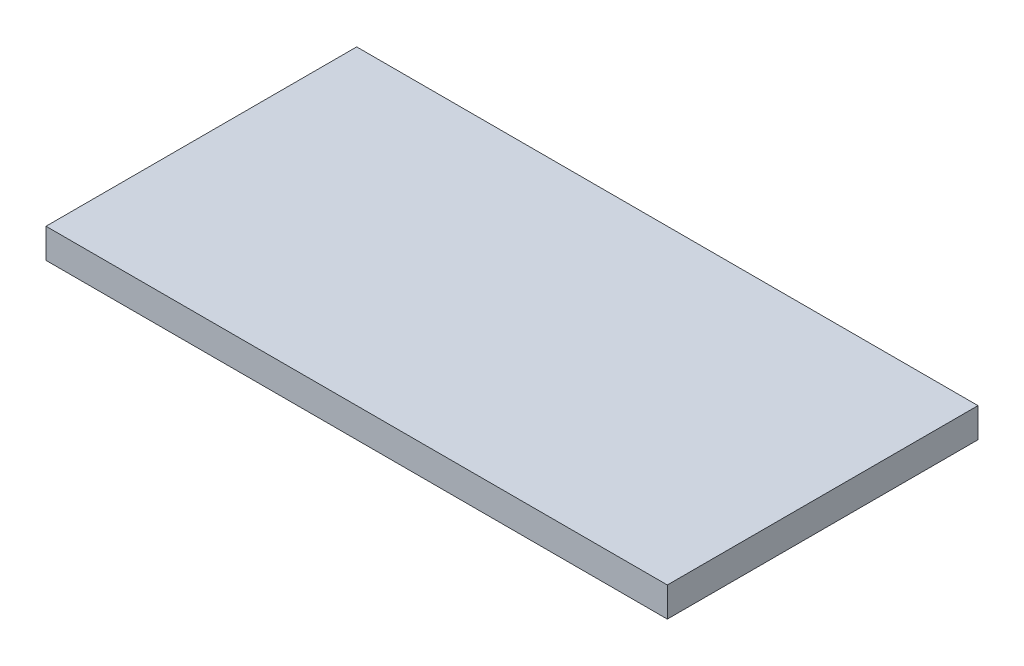
ISO-10303-21;
HEADER;
FILE_DESCRIPTION(('STEP AP214'),'2;1');
FILE_NAME('part.step','',(''),(''),'','','');
FILE_SCHEMA(('AUTOMOTIVE_DESIGN { 1 0 10303 214 1 1 1 1 }'));
ENDSEC;
DATA;
#1=APPLICATION_CONTEXT('core data for automotive mechanical design processes');
#2=APPLICATION_PROTOCOL_DEFINITION('international standard','automotive_design',2000,#1);
#3=PRODUCT_CONTEXT('',#1,'mechanical');
#4=PRODUCT('Part','Part','',(#3));
#5=PRODUCT_RELATED_PRODUCT_CATEGORY('part','',(#4));
#6=PRODUCT_DEFINITION_FORMATION('','',#4);
#7=PRODUCT_DEFINITION_CONTEXT('part definition',#1,'design');
#8=PRODUCT_DEFINITION('design','',#6,#7);
#9=PRODUCT_DEFINITION_SHAPE('','',#8);
#10=(LENGTH_UNIT() NAMED_UNIT(*) SI_UNIT(.MILLI.,.METRE.));
#11=(NAMED_UNIT(*) PLANE_ANGLE_UNIT() SI_UNIT($,.RADIAN.));
#12=(NAMED_UNIT(*) SI_UNIT($,.STERADIAN.) SOLID_ANGLE_UNIT());
#13=UNCERTAINTY_MEASURE_WITH_UNIT(LENGTH_MEASURE(1.E-05),#10,'distance_accuracy_value','');
#14=(GEOMETRIC_REPRESENTATION_CONTEXT(3) GLOBAL_UNCERTAINTY_ASSIGNED_CONTEXT((#13)) GLOBAL_UNIT_ASSIGNED_CONTEXT((#10,
#11,#12)) REPRESENTATION_CONTEXT('',''));
#15=CARTESIAN_POINT('',(0.,0.,0.));
#16=DIRECTION('',(0.,0.,1.));
#17=DIRECTION('',(1.,0.,0.));
#18=AXIS2_PLACEMENT_3D('',#15,#16,#17);
#19=CARTESIAN_POINT('',(100.,233.131797749979,50.));
#20=DIRECTION('',(-1.,0.,0.));
#21=DIRECTION('',(0.,0.,1.));
#22=AXIS2_PLACEMENT_3D('',#19,#20,#21);
#23=PLANE('',#22);
#24=DIRECTION('',(0.,0.,-1.));
#25=VECTOR('',#24,1.);
#26=CARTESIAN_POINT('',(100.,9.52500000000001,50.));
#27=LINE('',#26,#25);
#28=CARTESIAN_POINT('',(100.,9.52500000000001,50.));
#29=VERTEX_POINT('',#28);
#30=CARTESIAN_POINT('',(100.,9.52500000000001,-50.));
#31=VERTEX_POINT('',#30);
#32=EDGE_CURVE('E83',#29,#31,#27,.T.);
#33=ORIENTED_EDGE('',*,*,#32,.F.);
#34=DIRECTION('',(0.,-1.,0.));
#35=VECTOR('',#34,1.);
#36=CARTESIAN_POINT('',(100.,233.131797749979,50.));
#37=LINE('',#36,#35);
#38=CARTESIAN_POINT('',(100.,0.,50.));
#39=VERTEX_POINT('',#38);
#40=EDGE_CURVE('E37',#29,#39,#37,.T.);
#41=ORIENTED_EDGE('',*,*,#40,.T.);
#42=DIRECTION('',(0.,0.,-1.));
#43=VECTOR('',#42,1.);
#44=CARTESIAN_POINT('',(100.,0.,50.));
#45=LINE('',#44,#43);
#46=CARTESIAN_POINT('',(100.,0.,-50.));
#47=VERTEX_POINT('',#46);
#48=EDGE_CURVE('E81',#39,#47,#45,.T.);
#49=ORIENTED_EDGE('',*,*,#48,.T.);
#50=DIRECTION('',(0.,-1.,0.));
#51=VECTOR('',#50,1.);
#52=CARTESIAN_POINT('',(100.,233.131797749979,-50.));
#53=LINE('',#52,#51);
#54=EDGE_CURVE('E72',#31,#47,#53,.T.);
#55=ORIENTED_EDGE('',*,*,#54,.F.);
#56=EDGE_LOOP('',(#33,#41,#49,#55));
#57=FACE_BOUND('',#56,.T.);
#58=ADVANCED_FACE('F33',(#57),#23,.F.);
#59=CARTESIAN_POINT('',(-100.,233.131797749979,-50.));
#60=DIRECTION('',(0.,0.,1.));
#61=DIRECTION('',(1.,0.,0.));
#62=AXIS2_PLACEMENT_3D('',#59,#60,#61);
#63=PLANE('',#62);
#64=DIRECTION('',(-1.,0.,0.));
#65=VECTOR('',#64,1.);
#66=CARTESIAN_POINT('',(-100.,9.52500000000001,-50.));
#67=LINE('',#66,#65);
#68=CARTESIAN_POINT('',(-100.,9.52500000000001,-50.));
#69=VERTEX_POINT('',#68);
#70=EDGE_CURVE('E42',#31,#69,#67,.T.);
#71=ORIENTED_EDGE('',*,*,#70,.F.);
#72=ORIENTED_EDGE('',*,*,#54,.T.);
#73=DIRECTION('',(-1.,0.,0.));
#74=VECTOR('',#73,1.);
#75=CARTESIAN_POINT('',(-100.,0.,-50.));
#76=LINE('',#75,#74);
#77=CARTESIAN_POINT('',(-100.,0.,-50.));
#78=VERTEX_POINT('',#77);
#79=EDGE_CURVE('E93',#47,#78,#76,.T.);
#80=ORIENTED_EDGE('',*,*,#79,.T.);
#81=DIRECTION('',(0.,-1.,0.));
#82=VECTOR('',#81,1.);
#83=CARTESIAN_POINT('',(-100.,233.131797749979,-50.));
#84=LINE('',#83,#82);
#85=EDGE_CURVE('E102',#69,#78,#84,.T.);
#86=ORIENTED_EDGE('',*,*,#85,.F.);
#87=EDGE_LOOP('',(#71,#72,#80,#86));
#88=FACE_BOUND('',#87,.T.);
#89=ADVANCED_FACE('F106',(#88),#63,.F.);
#90=CARTESIAN_POINT('',(-100.,233.131797749979,50.));
#91=DIRECTION('',(1.,0.,0.));
#92=DIRECTION('',(0.,0.,-1.));
#93=AXIS2_PLACEMENT_3D('',#90,#91,#92);
#94=PLANE('',#93);
#95=DIRECTION('',(0.,0.,1.));
#96=VECTOR('',#95,1.);
#97=CARTESIAN_POINT('',(-100.,9.52500000000001,50.));
#98=LINE('',#97,#96);
#99=CARTESIAN_POINT('',(-100.,9.52500000000001,50.));
#100=VERTEX_POINT('',#99);
#101=EDGE_CURVE('E11',#69,#100,#98,.T.);
#102=ORIENTED_EDGE('',*,*,#101,.F.);
#103=ORIENTED_EDGE('',*,*,#85,.T.);
#104=DIRECTION('',(0.,0.,1.));
#105=VECTOR('',#104,1.);
#106=CARTESIAN_POINT('',(-100.,0.,50.));
#107=LINE('',#106,#105);
#108=CARTESIAN_POINT('',(-100.,0.,50.));
#109=VERTEX_POINT('',#108);
#110=EDGE_CURVE('E103',#78,#109,#107,.T.);
#111=ORIENTED_EDGE('',*,*,#110,.T.);
#112=DIRECTION('',(0.,-1.,0.));
#113=VECTOR('',#112,1.);
#114=CARTESIAN_POINT('',(-100.,233.131797749979,50.));
#115=LINE('',#114,#113);
#116=EDGE_CURVE('E55',#100,#109,#115,.T.);
#117=ORIENTED_EDGE('',*,*,#116,.F.);
#118=EDGE_LOOP('',(#102,#103,#111,#117));
#119=FACE_BOUND('',#118,.T.);
#120=ADVANCED_FACE('F105',(#119),#94,.F.);
#121=CARTESIAN_POINT('',(-100.,233.131797749979,50.));
#122=DIRECTION('',(0.,0.,-1.));
#123=DIRECTION('',(-1.,0.,0.));
#124=AXIS2_PLACEMENT_3D('',#121,#122,#123);
#125=PLANE('',#124);
#126=DIRECTION('',(1.,0.,0.));
#127=VECTOR('',#126,1.);
#128=CARTESIAN_POINT('',(-100.,9.52500000000001,50.));
#129=LINE('',#128,#127);
#130=EDGE_CURVE('E90',#100,#29,#129,.T.);
#131=ORIENTED_EDGE('',*,*,#130,.F.);
#132=ORIENTED_EDGE('',*,*,#116,.T.);
#133=DIRECTION('',(1.,0.,0.));
#134=VECTOR('',#133,1.);
#135=CARTESIAN_POINT('',(-100.,0.,50.));
#136=LINE('',#135,#134);
#137=EDGE_CURVE('E86',#109,#39,#136,.T.);
#138=ORIENTED_EDGE('',*,*,#137,.T.);
#139=ORIENTED_EDGE('',*,*,#40,.F.);
#140=EDGE_LOOP('',(#131,#132,#138,#139));
#141=FACE_BOUND('',#140,.T.);
#142=ADVANCED_FACE('F87',(#141),#125,.F.);
#143=CARTESIAN_POINT('',(0.,0.,0.));
#144=DIRECTION('',(0.,-1.,0.));
#145=DIRECTION('',(0.,0.,-1.));
#146=AXIS2_PLACEMENT_3D('',#143,#144,#145);
#147=PLANE('',#146);
#148=ORIENTED_EDGE('',*,*,#48,.F.);
#149=ORIENTED_EDGE('',*,*,#137,.F.);
#150=ORIENTED_EDGE('',*,*,#110,.F.);
#151=ORIENTED_EDGE('',*,*,#79,.F.);
#152=EDGE_LOOP('',(#148,#149,#150,#151));
#153=FACE_BOUND('',#152,.T.);
#154=ADVANCED_FACE('F92',(#153),#147,.T.);
#155=CARTESIAN_POINT('',(0.,9.525,0.));
#156=DIRECTION('',(0.,1.,0.));
#157=DIRECTION('',(0.,0.,1.));
#158=AXIS2_PLACEMENT_3D('',#155,#156,#157);
#159=PLANE('',#158);
#160=ORIENTED_EDGE('',*,*,#130,.T.);
#161=ORIENTED_EDGE('',*,*,#32,.T.);
#162=ORIENTED_EDGE('',*,*,#70,.T.);
#163=ORIENTED_EDGE('',*,*,#101,.T.);
#164=EDGE_LOOP('',(#160,#161,#162,#163));
#165=FACE_BOUND('',#164,.T.);
#166=ADVANCED_FACE('F35',(#165),#159,.T.);
#167=CLOSED_SHELL('',(#58,#89,#120,#142,#154,#166));
#168=MANIFOLD_SOLID_BREP('B2',#167);
#169=ADVANCED_BREP_SHAPE_REPRESENTATION('',(#18,#168),#14);
#170=SHAPE_DEFINITION_REPRESENTATION(#9,#169);
ENDSEC;
END-ISO-10303-21;
